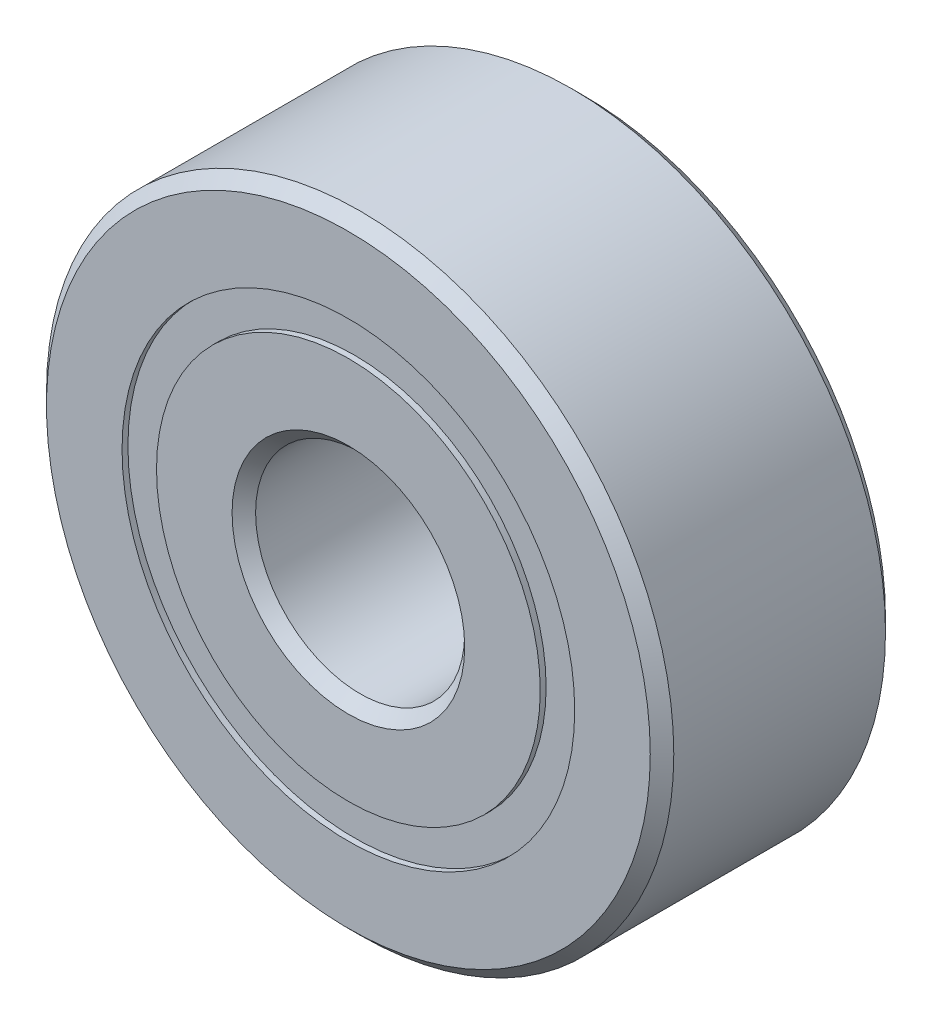
ISO-10303-21;
HEADER;
FILE_DESCRIPTION(('STEP AP214'),'2;1');
FILE_NAME('part.step','',(''),(''),'','','');
FILE_SCHEMA(('AUTOMOTIVE_DESIGN { 1 0 10303 214 1 1 1 1 }'));
ENDSEC;
DATA;
#1=APPLICATION_CONTEXT('core data for automotive mechanical design processes');
#2=APPLICATION_PROTOCOL_DEFINITION('international standard','automotive_design',2000,#1);
#3=PRODUCT_CONTEXT('',#1,'mechanical');
#4=PRODUCT('Part','Part','',(#3));
#5=PRODUCT_RELATED_PRODUCT_CATEGORY('part','',(#4));
#6=PRODUCT_DEFINITION_FORMATION('','',#4);
#7=PRODUCT_DEFINITION_CONTEXT('part definition',#1,'design');
#8=PRODUCT_DEFINITION('design','',#6,#7);
#9=PRODUCT_DEFINITION_SHAPE('','',#8);
#10=(LENGTH_UNIT() NAMED_UNIT(*) SI_UNIT(.MILLI.,.METRE.));
#11=(NAMED_UNIT(*) PLANE_ANGLE_UNIT() SI_UNIT($,.RADIAN.));
#12=(NAMED_UNIT(*) SI_UNIT($,.STERADIAN.) SOLID_ANGLE_UNIT());
#13=UNCERTAINTY_MEASURE_WITH_UNIT(LENGTH_MEASURE(1.E-05),#10,'distance_accuracy_value','');
#14=(GEOMETRIC_REPRESENTATION_CONTEXT(3) GLOBAL_UNCERTAINTY_ASSIGNED_CONTEXT((#13)) GLOBAL_UNIT_ASSIGNED_CONTEXT((#10,
#11,#12)) REPRESENTATION_CONTEXT('',''));
#15=CARTESIAN_POINT('',(0.,0.,0.));
#16=DIRECTION('',(0.,0.,1.));
#17=DIRECTION('',(1.,0.,0.));
#18=AXIS2_PLACEMENT_3D('',#15,#16,#17);
#19=CARTESIAN_POINT('',(0.,6.87335164835165,-3.39328125));
#20=DIRECTION('',(0.,0.,1.));
#21=DIRECTION('',(1.,0.,0.));
#22=AXIS2_PLACEMENT_3D('',#19,#20,#21);
#23=PLANE('',#22);
#24=CARTESIAN_POINT('',(0.,0.,-3.39328125));
#25=DIRECTION('',(0.,0.,1.));
#26=DIRECTION('',(1.,0.,0.));
#27=AXIS2_PLACEMENT_3D('',#24,#25,#26);
#28=CIRCLE('',#27,6.87335164835165);
#29=CARTESIAN_POINT('',(6.87335164835165,0.,-3.39328125));
#30=VERTEX_POINT('',#29);
#31=EDGE_CURVE('E62',#30,#30,#28,.T.);
#32=ORIENTED_EDGE('',*,*,#31,.F.);
#33=EDGE_LOOP('',(#32));
#34=FACE_BOUND('',#33,.T.);
#35=CARTESIAN_POINT('',(0.,0.,-3.39328125));
#36=DIRECTION('',(0.,0.,1.));
#37=DIRECTION('',(1.,0.,0.));
#38=AXIS2_PLACEMENT_3D('',#35,#36,#37);
#39=CIRCLE('',#38,5.82664835164835);
#40=CARTESIAN_POINT('',(5.82664835164835,0.,-3.39328125));
#41=VERTEX_POINT('',#40);
#42=EDGE_CURVE('E11',#41,#41,#39,.T.);
#43=ORIENTED_EDGE('',*,*,#42,.T.);
#44=EDGE_LOOP('',(#43));
#45=FACE_BOUND('',#44,.T.);
#46=ADVANCED_FACE('F48',(#34,#45),#23,.F.);
#47=CARTESIAN_POINT('',(0.,0.,3.571875));
#48=DIRECTION('',(0.,0.,1.));
#49=DIRECTION('',(1.,0.,0.));
#50=AXIS2_PLACEMENT_3D('',#47,#48,#49);
#51=CYLINDRICAL_SURFACE('',#50,5.82664835164835);
#52=ORIENTED_EDGE('',*,*,#42,.F.);
#53=EDGE_LOOP('',(#52));
#54=FACE_BOUND('',#53,.T.);
#55=CARTESIAN_POINT('',(0.,0.,-1.67154216154795));
#56=DIRECTION('',(0.,0.,1.));
#57=DIRECTION('',(1.,0.,0.));
#58=AXIS2_PLACEMENT_3D('',#55,#56,#57);
#59=CIRCLE('',#58,5.82664835164835);
#60=CARTESIAN_POINT('',(5.82664835164835,0.,-1.67154216154795));
#61=VERTEX_POINT('',#60);
#62=EDGE_CURVE('E54',#61,#61,#59,.T.);
#63=ORIENTED_EDGE('',*,*,#62,.T.);
#64=EDGE_LOOP('',(#63));
#65=FACE_BOUND('',#64,.T.);
#66=ADVANCED_FACE('F71',(#54,#65),#51,.F.);
#67=CARTESIAN_POINT('',(0.,6.87335164835165,-1.67154216154795));
#68=DIRECTION('',(0.,0.,-1.));
#69=DIRECTION('',(-1.,0.,0.));
#70=AXIS2_PLACEMENT_3D('',#67,#68,#69);
#71=PLANE('',#70);
#72=ORIENTED_EDGE('',*,*,#62,.F.);
#73=EDGE_LOOP('',(#72));
#74=FACE_BOUND('',#73,.T.);
#75=CARTESIAN_POINT('',(0.,0.,-1.67154216154795));
#76=DIRECTION('',(0.,0.,1.));
#77=DIRECTION('',(1.,0.,0.));
#78=AXIS2_PLACEMENT_3D('',#75,#76,#77);
#79=CIRCLE('',#78,6.87335164835165);
#80=CARTESIAN_POINT('',(6.87335164835165,0.,-1.67154216154795));
#81=VERTEX_POINT('',#80);
#82=EDGE_CURVE('E58',#81,#81,#79,.T.);
#83=ORIENTED_EDGE('',*,*,#82,.T.);
#84=EDGE_LOOP('',(#83));
#85=FACE_BOUND('',#84,.T.);
#86=ADVANCED_FACE('F75',(#74,#85),#71,.F.);
#87=CARTESIAN_POINT('',(0.,0.,3.571875));
#88=DIRECTION('',(0.,0.,1.));
#89=DIRECTION('',(1.,0.,0.));
#90=AXIS2_PLACEMENT_3D('',#87,#88,#89);
#91=CYLINDRICAL_SURFACE('',#90,6.87335164835165);
#92=ORIENTED_EDGE('',*,*,#82,.F.);
#93=EDGE_LOOP('',(#92));
#94=FACE_BOUND('',#93,.T.);
#95=ORIENTED_EDGE('',*,*,#31,.T.);
#96=EDGE_LOOP('',(#95));
#97=FACE_BOUND('',#96,.T.);
#98=ADVANCED_FACE('F68',(#94,#97),#91,.T.);
#99=CLOSED_SHELL('',(#46,#66,#86,#98));
#100=MANIFOLD_SOLID_BREP('B2',#99);
#101=CARTESIAN_POINT('',(0.,6.87335164835165,3.39328125));
#102=DIRECTION('',(0.,0.,-1.));
#103=DIRECTION('',(-1.,0.,0.));
#104=AXIS2_PLACEMENT_3D('',#101,#102,#103);
#105=PLANE('',#104);
#106=CARTESIAN_POINT('',(0.,0.,3.39328125));
#107=DIRECTION('',(0.,0.,1.));
#108=DIRECTION('',(1.,0.,0.));
#109=AXIS2_PLACEMENT_3D('',#106,#107,#108);
#110=CIRCLE('',#109,5.82664835164835);
#111=CARTESIAN_POINT('',(5.82664835164835,0.,3.39328125));
#112=VERTEX_POINT('',#111);
#113=EDGE_CURVE('E47',#112,#112,#110,.T.);
#114=ORIENTED_EDGE('',*,*,#113,.F.);
#115=EDGE_LOOP('',(#114));
#116=FACE_BOUND('',#115,.T.);
#117=CARTESIAN_POINT('',(0.,0.,3.39328125));
#118=DIRECTION('',(0.,0.,1.));
#119=DIRECTION('',(1.,0.,0.));
#120=AXIS2_PLACEMENT_3D('',#117,#118,#119);
#121=CIRCLE('',#120,6.87335164835165);
#122=CARTESIAN_POINT('',(6.87335164835165,0.,3.39328125));
#123=VERTEX_POINT('',#122);
#124=EDGE_CURVE('E134',#123,#123,#121,.T.);
#125=ORIENTED_EDGE('',*,*,#124,.T.);
#126=EDGE_LOOP('',(#125));
#127=FACE_BOUND('',#126,.T.);
#128=ADVANCED_FACE('F120',(#116,#127),#105,.F.);
#129=CARTESIAN_POINT('',(0.,0.,3.571875));
#130=DIRECTION('',(0.,0.,1.));
#131=DIRECTION('',(1.,0.,0.));
#132=AXIS2_PLACEMENT_3D('',#129,#130,#131);
#133=CYLINDRICAL_SURFACE('',#132,5.82664835164835);
#134=CARTESIAN_POINT('',(0.,0.,1.67154216154795));
#135=DIRECTION('',(0.,0.,1.));
#136=DIRECTION('',(1.,0.,0.));
#137=AXIS2_PLACEMENT_3D('',#134,#135,#136);
#138=CIRCLE('',#137,5.82664835164835);
#139=CARTESIAN_POINT('',(5.82664835164835,0.,1.67154216154795));
#140=VERTEX_POINT('',#139);
#141=EDGE_CURVE('E126',#140,#140,#138,.T.);
#142=ORIENTED_EDGE('',*,*,#141,.F.);
#143=EDGE_LOOP('',(#142));
#144=FACE_BOUND('',#143,.T.);
#145=ORIENTED_EDGE('',*,*,#113,.T.);
#146=EDGE_LOOP('',(#145));
#147=FACE_BOUND('',#146,.T.);
#148=ADVANCED_FACE('F149',(#144,#147),#133,.F.);
#149=CARTESIAN_POINT('',(0.,6.87335164835165,1.67154216154795));
#150=DIRECTION('',(0.,0.,1.));
#151=DIRECTION('',(1.,0.,0.));
#152=AXIS2_PLACEMENT_3D('',#149,#150,#151);
#153=PLANE('',#152);
#154=CARTESIAN_POINT('',(0.,0.,1.67154216154795));
#155=DIRECTION('',(0.,0.,1.));
#156=DIRECTION('',(1.,0.,0.));
#157=AXIS2_PLACEMENT_3D('',#154,#155,#156);
#158=CIRCLE('',#157,6.87335164835165);
#159=CARTESIAN_POINT('',(6.87335164835165,0.,1.67154216154795));
#160=VERTEX_POINT('',#159);
#161=EDGE_CURVE('E130',#160,#160,#158,.T.);
#162=ORIENTED_EDGE('',*,*,#161,.F.);
#163=EDGE_LOOP('',(#162));
#164=FACE_BOUND('',#163,.T.);
#165=ORIENTED_EDGE('',*,*,#141,.T.);
#166=EDGE_LOOP('',(#165));
#167=FACE_BOUND('',#166,.T.);
#168=ADVANCED_FACE('F144',(#164,#167),#153,.F.);
#169=CARTESIAN_POINT('',(0.,0.,3.571875));
#170=DIRECTION('',(0.,0.,1.));
#171=DIRECTION('',(1.,0.,0.));
#172=AXIS2_PLACEMENT_3D('',#169,#170,#171);
#173=CYLINDRICAL_SURFACE('',#172,6.87335164835165);
#174=ORIENTED_EDGE('',*,*,#124,.F.);
#175=EDGE_LOOP('',(#174));
#176=FACE_BOUND('',#175,.T.);
#177=ORIENTED_EDGE('',*,*,#161,.T.);
#178=EDGE_LOOP('',(#177));
#179=FACE_BOUND('',#178,.T.);
#180=ADVANCED_FACE('F141',(#176,#179),#173,.T.);
#181=CLOSED_SHELL('',(#128,#148,#168,#180));
#182=MANIFOLD_SOLID_BREP('B6',#181);
#183=CARTESIAN_POINT('',(0.,5.82664835164835,3.571875));
#184=DIRECTION('',(0.,0.,-1.));
#185=DIRECTION('',(-1.,0.,0.));
#186=AXIS2_PLACEMENT_3D('',#183,#184,#185);
#187=PLANE('',#186);
#188=CARTESIAN_POINT('',(0.,0.,3.571875));
#189=DIRECTION('',(0.,0.,1.));
#190=DIRECTION('',(1.,0.,0.));
#191=AXIS2_PLACEMENT_3D('',#188,#189,#190);
#192=CIRCLE('',#191,3.5321875);
#193=CARTESIAN_POINT('',(3.5321875,0.,3.571875));
#194=VERTEX_POINT('',#193);
#195=EDGE_CURVE('E219',#194,#194,#192,.T.);
#196=ORIENTED_EDGE('',*,*,#195,.F.);
#197=EDGE_LOOP('',(#196));
#198=FACE_BOUND('',#197,.T.);
#199=CARTESIAN_POINT('',(0.,0.,3.571875));
#200=DIRECTION('',(0.,0.,1.));
#201=DIRECTION('',(1.,0.,0.));
#202=AXIS2_PLACEMENT_3D('',#199,#200,#201);
#203=CIRCLE('',#202,5.82664835164835);
#204=CARTESIAN_POINT('',(5.82664835164835,0.,3.571875));
#205=VERTEX_POINT('',#204);
#206=EDGE_CURVE('E119',#205,#205,#203,.T.);
#207=ORIENTED_EDGE('',*,*,#206,.T.);
#208=EDGE_LOOP('',(#207));
#209=FACE_BOUND('',#208,.T.);
#210=ADVANCED_FACE('F191',(#198,#209),#187,.F.);
#211=CARTESIAN_POINT('',(0.,0.,3.571875));
#212=DIRECTION('',(0.,0.,1.));
#213=DIRECTION('',(1.,0.,0.));
#214=AXIS2_PLACEMENT_3D('',#211,#212,#213);
#215=CYLINDRICAL_SURFACE('',#214,5.82664835164835);
#216=ORIENTED_EDGE('',*,*,#206,.F.);
#217=EDGE_LOOP('',(#216));
#218=FACE_BOUND('',#217,.T.);
#219=CARTESIAN_POINT('',(0.,0.,1.5875));
#220=DIRECTION('',(0.,0.,1.));
#221=DIRECTION('',(1.,0.,0.));
#222=AXIS2_PLACEMENT_3D('',#219,#220,#221);
#223=CIRCLE('',#222,5.82664835164835);
#224=CARTESIAN_POINT('',(5.82664835164835,0.,1.5875));
#225=VERTEX_POINT('',#224);
#226=EDGE_CURVE('E197',#225,#225,#223,.T.);
#227=ORIENTED_EDGE('',*,*,#226,.T.);
#228=EDGE_LOOP('',(#227));
#229=FACE_BOUND('',#228,.T.);
#230=ADVANCED_FACE('F226',(#218,#229),#215,.T.);
#231=CARTESIAN_POINT('',(0.,0.,0.));
#232=DIRECTION('',(0.,0.,1.));
#233=DIRECTION('',(1.,0.,0.));
#234=AXIS2_PLACEMENT_3D('',#231,#232,#233);
#235=TOROIDAL_SURFACE('',#234,6.34999999999999,1.67154216154795);
#236=ORIENTED_EDGE('',*,*,#226,.F.);
#237=EDGE_LOOP('',(#236));
#238=FACE_BOUND('',#237,.T.);
#239=CARTESIAN_POINT('',(0.,0.,-1.5875));
#240=DIRECTION('',(0.,0.,1.));
#241=DIRECTION('',(1.,0.,0.));
#242=AXIS2_PLACEMENT_3D('',#239,#240,#241);
#243=CIRCLE('',#242,5.82664835164835);
#244=CARTESIAN_POINT('',(5.82664835164835,0.,-1.5875));
#245=VERTEX_POINT('',#244);
#246=EDGE_CURVE('E201',#245,#245,#243,.T.);
#247=ORIENTED_EDGE('',*,*,#246,.T.);
#248=EDGE_LOOP('',(#247));
#249=FACE_BOUND('',#248,.T.);
#250=ADVANCED_FACE('F230',(#238,#249),#235,.F.);
#251=CARTESIAN_POINT('',(0.,0.,3.571875));
#252=DIRECTION('',(0.,0.,1.));
#253=DIRECTION('',(1.,0.,0.));
#254=AXIS2_PLACEMENT_3D('',#251,#252,#253);
#255=CYLINDRICAL_SURFACE('',#254,5.82664835164835);
#256=ORIENTED_EDGE('',*,*,#246,.F.);
#257=EDGE_LOOP('',(#256));
#258=FACE_BOUND('',#257,.T.);
#259=CARTESIAN_POINT('',(0.,0.,-3.571875));
#260=DIRECTION('',(0.,0.,1.));
#261=DIRECTION('',(1.,0.,0.));
#262=AXIS2_PLACEMENT_3D('',#259,#260,#261);
#263=CIRCLE('',#262,5.82664835164835);
#264=CARTESIAN_POINT('',(5.82664835164835,0.,-3.571875));
#265=VERTEX_POINT('',#264);
#266=EDGE_CURVE('E205',#265,#265,#263,.T.);
#267=ORIENTED_EDGE('',*,*,#266,.T.);
#268=EDGE_LOOP('',(#267));
#269=FACE_BOUND('',#268,.T.);
#270=ADVANCED_FACE('F235',(#258,#269),#255,.T.);
#271=CARTESIAN_POINT('',(0.,3.5321875,-3.571875));
#272=DIRECTION('',(0.,0.,1.));
#273=DIRECTION('',(1.,0.,0.));
#274=AXIS2_PLACEMENT_3D('',#271,#272,#273);
#275=PLANE('',#274);
#276=ORIENTED_EDGE('',*,*,#266,.F.);
#277=EDGE_LOOP('',(#276));
#278=FACE_BOUND('',#277,.T.);
#279=CARTESIAN_POINT('',(0.,0.,-3.571875));
#280=DIRECTION('',(0.,0.,1.));
#281=DIRECTION('',(1.,0.,0.));
#282=AXIS2_PLACEMENT_3D('',#279,#280,#281);
#283=CIRCLE('',#282,3.5321875);
#284=CARTESIAN_POINT('',(3.5321875,0.,-3.571875));
#285=VERTEX_POINT('',#284);
#286=EDGE_CURVE('E210',#285,#285,#283,.T.);
#287=ORIENTED_EDGE('',*,*,#286,.T.);
#288=EDGE_LOOP('',(#287));
#289=FACE_BOUND('',#288,.T.);
#290=ADVANCED_FACE('F241',(#278,#289),#275,.F.);
#291=CARTESIAN_POINT('',(0.,0.,-3.2146875));
#292=DIRECTION('',(0.,0.,-1.));
#293=DIRECTION('',(-1.,0.,0.));
#294=AXIS2_PLACEMENT_3D('',#291,#292,#293);
#295=CONICAL_SURFACE('',#294,3.175,0.785398163397446);
#296=ORIENTED_EDGE('',*,*,#286,.F.);
#297=EDGE_LOOP('',(#296));
#298=FACE_BOUND('',#297,.T.);
#299=CARTESIAN_POINT('',(0.,0.,-3.2146875));
#300=DIRECTION('',(0.,0.,1.));
#301=DIRECTION('',(1.,0.,0.));
#302=AXIS2_PLACEMENT_3D('',#299,#300,#301);
#303=CIRCLE('',#302,3.175);
#304=CARTESIAN_POINT('',(3.175,0.,-3.2146875));
#305=VERTEX_POINT('',#304);
#306=EDGE_CURVE('E213',#305,#305,#303,.T.);
#307=ORIENTED_EDGE('',*,*,#306,.T.);
#308=EDGE_LOOP('',(#307));
#309=FACE_BOUND('',#308,.T.);
#310=ADVANCED_FACE('F245',(#298,#309),#295,.F.);
#311=CARTESIAN_POINT('',(0.,0.,3.571875));
#312=DIRECTION('',(0.,0.,1.));
#313=DIRECTION('',(1.,0.,0.));
#314=AXIS2_PLACEMENT_3D('',#311,#312,#313);
#315=CYLINDRICAL_SURFACE('',#314,3.175);
#316=ORIENTED_EDGE('',*,*,#306,.F.);
#317=EDGE_LOOP('',(#316));
#318=FACE_BOUND('',#317,.T.);
#319=CARTESIAN_POINT('',(0.,0.,3.2146875));
#320=DIRECTION('',(0.,0.,1.));
#321=DIRECTION('',(1.,0.,0.));
#322=AXIS2_PLACEMENT_3D('',#319,#320,#321);
#323=CIRCLE('',#322,3.175);
#324=CARTESIAN_POINT('',(3.175,0.,3.2146875));
#325=VERTEX_POINT('',#324);
#326=EDGE_CURVE('E216',#325,#325,#323,.T.);
#327=ORIENTED_EDGE('',*,*,#326,.T.);
#328=EDGE_LOOP('',(#327));
#329=FACE_BOUND('',#328,.T.);
#330=ADVANCED_FACE('F249',(#318,#329),#315,.F.);
#331=CARTESIAN_POINT('',(0.,0.,3.571875));
#332=DIRECTION('',(0.,0.,1.));
#333=DIRECTION('',(1.,0.,0.));
#334=AXIS2_PLACEMENT_3D('',#331,#332,#333);
#335=CONICAL_SURFACE('',#334,3.5321875,0.78539816339745);
#336=ORIENTED_EDGE('',*,*,#326,.F.);
#337=EDGE_LOOP('',(#336));
#338=FACE_BOUND('',#337,.T.);
#339=ORIENTED_EDGE('',*,*,#195,.T.);
#340=EDGE_LOOP('',(#339));
#341=FACE_BOUND('',#340,.T.);
#342=ADVANCED_FACE('F223',(#338,#341),#335,.F.);
#343=CLOSED_SHELL('',(#210,#230,#250,#270,#290,#310,#330,#342));
#344=MANIFOLD_SOLID_BREP('B42',#343);
#345=CARTESIAN_POINT('',(0.,0.,3.2146875));
#346=DIRECTION('',(0.,0.,-1.));
#347=DIRECTION('',(-1.,0.,0.));
#348=AXIS2_PLACEMENT_3D('',#345,#346,#347);
#349=CONICAL_SURFACE('',#348,9.525,0.785398163397448);
#350=CARTESIAN_POINT('',(0.,0.,3.571875));
#351=DIRECTION('',(0.,0.,1.));
#352=DIRECTION('',(1.,0.,0.));
#353=AXIS2_PLACEMENT_3D('',#350,#351,#352);
#354=CIRCLE('',#353,9.1678125);
#355=CARTESIAN_POINT('',(9.1678125,0.,3.571875));
#356=VERTEX_POINT('',#355);
#357=EDGE_CURVE('E343',#356,#356,#354,.T.);
#358=ORIENTED_EDGE('',*,*,#357,.F.);
#359=EDGE_LOOP('',(#358));
#360=FACE_BOUND('',#359,.T.);
#361=CARTESIAN_POINT('',(0.,0.,3.2146875));
#362=DIRECTION('',(0.,0.,1.));
#363=DIRECTION('',(1.,0.,0.));
#364=AXIS2_PLACEMENT_3D('',#361,#362,#363);
#365=CIRCLE('',#364,9.525);
#366=CARTESIAN_POINT('',(9.525,0.,3.2146875));
#367=VERTEX_POINT('',#366);
#368=EDGE_CURVE('E190',#367,#367,#365,.T.);
#369=ORIENTED_EDGE('',*,*,#368,.T.);
#370=EDGE_LOOP('',(#369));
#371=FACE_BOUND('',#370,.T.);
#372=ADVANCED_FACE('F315',(#360,#371),#349,.T.);
#373=CARTESIAN_POINT('',(0.,0.,3.571875));
#374=DIRECTION('',(0.,0.,1.));
#375=DIRECTION('',(1.,0.,0.));
#376=AXIS2_PLACEMENT_3D('',#373,#374,#375);
#377=CYLINDRICAL_SURFACE('',#376,9.525);
#378=ORIENTED_EDGE('',*,*,#368,.F.);
#379=EDGE_LOOP('',(#378));
#380=FACE_BOUND('',#379,.T.);
#381=CARTESIAN_POINT('',(0.,0.,-3.2146875));
#382=DIRECTION('',(0.,0.,1.));
#383=DIRECTION('',(1.,0.,0.));
#384=AXIS2_PLACEMENT_3D('',#381,#382,#383);
#385=CIRCLE('',#384,9.525);
#386=CARTESIAN_POINT('',(9.525,0.,-3.2146875));
#387=VERTEX_POINT('',#386);
#388=EDGE_CURVE('E321',#387,#387,#385,.T.);
#389=ORIENTED_EDGE('',*,*,#388,.T.);
#390=EDGE_LOOP('',(#389));
#391=FACE_BOUND('',#390,.T.);
#392=ADVANCED_FACE('F350',(#380,#391),#377,.T.);
#393=CARTESIAN_POINT('',(0.,0.,-3.571875));
#394=DIRECTION('',(0.,0.,1.));
#395=DIRECTION('',(1.,0.,0.));
#396=AXIS2_PLACEMENT_3D('',#393,#394,#395);
#397=CONICAL_SURFACE('',#396,9.1678125,0.785398163397446);
#398=ORIENTED_EDGE('',*,*,#388,.F.);
#399=EDGE_LOOP('',(#398));
#400=FACE_BOUND('',#399,.T.);
#401=CARTESIAN_POINT('',(0.,0.,-3.571875));
#402=DIRECTION('',(0.,0.,1.));
#403=DIRECTION('',(1.,0.,0.));
#404=AXIS2_PLACEMENT_3D('',#401,#402,#403);
#405=CIRCLE('',#404,9.1678125);
#406=CARTESIAN_POINT('',(9.1678125,0.,-3.571875));
#407=VERTEX_POINT('',#406);
#408=EDGE_CURVE('E325',#407,#407,#405,.T.);
#409=ORIENTED_EDGE('',*,*,#408,.T.);
#410=EDGE_LOOP('',(#409));
#411=FACE_BOUND('',#410,.T.);
#412=ADVANCED_FACE('F354',(#400,#411),#397,.T.);
#413=CARTESIAN_POINT('',(0.,9.1678125,-3.571875));
#414=DIRECTION('',(0.,0.,1.));
#415=DIRECTION('',(1.,0.,0.));
#416=AXIS2_PLACEMENT_3D('',#413,#414,#415);
#417=PLANE('',#416);
#418=ORIENTED_EDGE('',*,*,#408,.F.);
#419=EDGE_LOOP('',(#418));
#420=FACE_BOUND('',#419,.T.);
#421=CARTESIAN_POINT('',(0.,0.,-3.571875));
#422=DIRECTION('',(0.,0.,1.));
#423=DIRECTION('',(1.,0.,0.));
#424=AXIS2_PLACEMENT_3D('',#421,#422,#423);
#425=CIRCLE('',#424,6.87335164835165);
#426=CARTESIAN_POINT('',(6.87335164835165,0.,-3.571875));
#427=VERTEX_POINT('',#426);
#428=EDGE_CURVE('E329',#427,#427,#425,.T.);
#429=ORIENTED_EDGE('',*,*,#428,.T.);
#430=EDGE_LOOP('',(#429));
#431=FACE_BOUND('',#430,.T.);
#432=ADVANCED_FACE('F359',(#420,#431),#417,.F.);
#433=CARTESIAN_POINT('',(0.,0.,3.571875));
#434=DIRECTION('',(0.,0.,1.));
#435=DIRECTION('',(1.,0.,0.));
#436=AXIS2_PLACEMENT_3D('',#433,#434,#435);
#437=CYLINDRICAL_SURFACE('',#436,6.87335164835165);
#438=ORIENTED_EDGE('',*,*,#428,.F.);
#439=EDGE_LOOP('',(#438));
#440=FACE_BOUND('',#439,.T.);
#441=CARTESIAN_POINT('',(0.,0.,-1.5875));
#442=DIRECTION('',(0.,0.,1.));
#443=DIRECTION('',(1.,0.,0.));
#444=AXIS2_PLACEMENT_3D('',#441,#442,#443);
#445=CIRCLE('',#444,6.87335164835165);
#446=CARTESIAN_POINT('',(6.87335164835165,0.,-1.5875));
#447=VERTEX_POINT('',#446);
#448=EDGE_CURVE('E334',#447,#447,#445,.T.);
#449=ORIENTED_EDGE('',*,*,#448,.T.);
#450=EDGE_LOOP('',(#449));
#451=FACE_BOUND('',#450,.T.);
#452=ADVANCED_FACE('F365',(#440,#451),#437,.F.);
#453=CARTESIAN_POINT('',(0.,0.,0.));
#454=DIRECTION('',(0.,0.,1.));
#455=DIRECTION('',(1.,0.,0.));
#456=AXIS2_PLACEMENT_3D('',#453,#454,#455);
#457=TOROIDAL_SURFACE('',#456,6.35,1.67154216154795);
#458=ORIENTED_EDGE('',*,*,#448,.F.);
#459=EDGE_LOOP('',(#458));
#460=FACE_BOUND('',#459,.T.);
#461=CARTESIAN_POINT('',(0.,0.,1.5875));
#462=DIRECTION('',(0.,0.,1.));
#463=DIRECTION('',(1.,0.,0.));
#464=AXIS2_PLACEMENT_3D('',#461,#462,#463);
#465=CIRCLE('',#464,6.87335164835165);
#466=CARTESIAN_POINT('',(6.87335164835165,0.,1.5875));
#467=VERTEX_POINT('',#466);
#468=EDGE_CURVE('E337',#467,#467,#465,.T.);
#469=ORIENTED_EDGE('',*,*,#468,.T.);
#470=EDGE_LOOP('',(#469));
#471=FACE_BOUND('',#470,.T.);
#472=ADVANCED_FACE('F369',(#460,#471),#457,.F.);
#473=CARTESIAN_POINT('',(0.,0.,3.571875));
#474=DIRECTION('',(0.,0.,1.));
#475=DIRECTION('',(1.,0.,0.));
#476=AXIS2_PLACEMENT_3D('',#473,#474,#475);
#477=CYLINDRICAL_SURFACE('',#476,6.87335164835165);
#478=ORIENTED_EDGE('',*,*,#468,.F.);
#479=EDGE_LOOP('',(#478));
#480=FACE_BOUND('',#479,.T.);
#481=CARTESIAN_POINT('',(0.,0.,3.571875));
#482=DIRECTION('',(0.,0.,1.));
#483=DIRECTION('',(1.,0.,0.));
#484=AXIS2_PLACEMENT_3D('',#481,#482,#483);
#485=CIRCLE('',#484,6.87335164835165);
#486=CARTESIAN_POINT('',(6.87335164835165,0.,3.571875));
#487=VERTEX_POINT('',#486);
#488=EDGE_CURVE('E340',#487,#487,#485,.T.);
#489=ORIENTED_EDGE('',*,*,#488,.T.);
#490=EDGE_LOOP('',(#489));
#491=FACE_BOUND('',#490,.T.);
#492=ADVANCED_FACE('F373',(#480,#491),#477,.F.);
#493=CARTESIAN_POINT('',(0.,9.1678125,3.571875));
#494=DIRECTION('',(0.,0.,-1.));
#495=DIRECTION('',(-1.,0.,0.));
#496=AXIS2_PLACEMENT_3D('',#493,#494,#495);
#497=PLANE('',#496);
#498=ORIENTED_EDGE('',*,*,#488,.F.);
#499=EDGE_LOOP('',(#498));
#500=FACE_BOUND('',#499,.T.);
#501=ORIENTED_EDGE('',*,*,#357,.T.);
#502=EDGE_LOOP('',(#501));
#503=FACE_BOUND('',#502,.T.);
#504=ADVANCED_FACE('F347',(#500,#503),#497,.F.);
#505=CLOSED_SHELL('',(#372,#392,#412,#432,#452,#472,#492,#504));
#506=MANIFOLD_SOLID_BREP('B114',#505);
#507=ADVANCED_BREP_SHAPE_REPRESENTATION('',(#18,#100,#182,#344,#506),#14);
#508=SHAPE_DEFINITION_REPRESENTATION(#9,#507);
ENDSEC;
END-ISO-10303-21;
